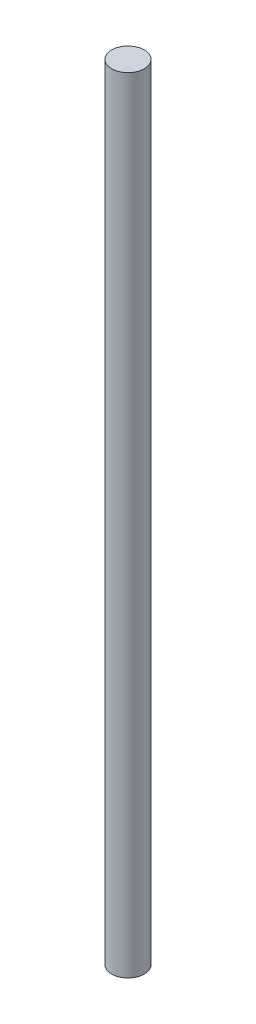
ISO-10303-21;
HEADER;
FILE_DESCRIPTION(('STEP AP214'),'2;1');
FILE_NAME('part.step','',(''),(''),'','','');
FILE_SCHEMA(('AUTOMOTIVE_DESIGN { 1 0 10303 214 1 1 1 1 }'));
ENDSEC;
DATA;
#1=APPLICATION_CONTEXT('core data for automotive mechanical design processes');
#2=APPLICATION_PROTOCOL_DEFINITION('international standard','automotive_design',2000,#1);
#3=PRODUCT_CONTEXT('',#1,'mechanical');
#4=PRODUCT('Part','Part','',(#3));
#5=PRODUCT_RELATED_PRODUCT_CATEGORY('part','',(#4));
#6=PRODUCT_DEFINITION_FORMATION('','',#4);
#7=PRODUCT_DEFINITION_CONTEXT('part definition',#1,'design');
#8=PRODUCT_DEFINITION('design','',#6,#7);
#9=PRODUCT_DEFINITION_SHAPE('','',#8);
#10=(LENGTH_UNIT() NAMED_UNIT(*) SI_UNIT(.MILLI.,.METRE.));
#11=(NAMED_UNIT(*) PLANE_ANGLE_UNIT() SI_UNIT($,.RADIAN.));
#12=(NAMED_UNIT(*) SI_UNIT($,.STERADIAN.) SOLID_ANGLE_UNIT());
#13=UNCERTAINTY_MEASURE_WITH_UNIT(LENGTH_MEASURE(1.E-05),#10,'distance_accuracy_value','');
#14=(GEOMETRIC_REPRESENTATION_CONTEXT(3) GLOBAL_UNCERTAINTY_ASSIGNED_CONTEXT((#13)) GLOBAL_UNIT_ASSIGNED_CONTEXT((#10,
#11,#12)) REPRESENTATION_CONTEXT('',''));
#15=CARTESIAN_POINT('',(0.,0.,0.));
#16=DIRECTION('',(0.,0.,1.));
#17=DIRECTION('',(1.,0.,0.));
#18=AXIS2_PLACEMENT_3D('',#15,#16,#17);
#19=CARTESIAN_POINT('',(0.,120.,0.));
#20=DIRECTION('',(0.,-1.,0.));
#21=DIRECTION('',(0.,0.,-1.));
#22=AXIS2_PLACEMENT_3D('',#19,#20,#21);
#23=CYLINDRICAL_SURFACE('',#22,2.5);
#24=CARTESIAN_POINT('',(0.,120.,0.));
#25=DIRECTION('',(0.,1.,0.));
#26=DIRECTION('',(0.,0.,1.));
#27=AXIS2_PLACEMENT_3D('',#24,#25,#26);
#28=CIRCLE('',#27,2.5);
#29=CARTESIAN_POINT('',(0.,120.,2.5));
#30=VERTEX_POINT('',#29);
#31=EDGE_CURVE('E10',#30,#30,#28,.T.);
#32=ORIENTED_EDGE('',*,*,#31,.F.);
#33=EDGE_LOOP('',(#32));
#34=FACE_BOUND('',#33,.T.);
#35=CARTESIAN_POINT('',(0.,0.,0.));
#36=DIRECTION('',(0.,1.,0.));
#37=DIRECTION('',(0.,0.,1.));
#38=AXIS2_PLACEMENT_3D('',#35,#36,#37);
#39=CIRCLE('',#38,2.5);
#40=CARTESIAN_POINT('',(0.,0.,2.5));
#41=VERTEX_POINT('',#40);
#42=EDGE_CURVE('E38',#41,#41,#39,.T.);
#43=ORIENTED_EDGE('',*,*,#42,.T.);
#44=EDGE_LOOP('',(#43));
#45=FACE_BOUND('',#44,.T.);
#46=ADVANCED_FACE('F35',(#34,#45),#23,.T.);
#47=CARTESIAN_POINT('',(0.,120.,0.));
#48=DIRECTION('',(0.,1.,0.));
#49=DIRECTION('',(0.,0.,1.));
#50=AXIS2_PLACEMENT_3D('',#47,#48,#49);
#51=PLANE('',#50);
#52=ORIENTED_EDGE('',*,*,#31,.T.);
#53=EDGE_LOOP('',(#52));
#54=FACE_BOUND('',#53,.T.);
#55=ADVANCED_FACE('F50',(#54),#51,.T.);
#56=CARTESIAN_POINT('',(0.,0.,0.));
#57=DIRECTION('',(0.,1.,0.));
#58=DIRECTION('',(0.,0.,1.));
#59=AXIS2_PLACEMENT_3D('',#56,#57,#58);
#60=PLANE('',#59);
#61=ORIENTED_EDGE('',*,*,#42,.F.);
#62=EDGE_LOOP('',(#61));
#63=FACE_BOUND('',#62,.T.);
#64=ADVANCED_FACE('F48',(#63),#60,.F.);
#65=CLOSED_SHELL('',(#46,#55,#64));
#66=MANIFOLD_SOLID_BREP('B2',#65);
#67=ADVANCED_BREP_SHAPE_REPRESENTATION('',(#18,#66),#14);
#68=SHAPE_DEFINITION_REPRESENTATION(#9,#67);
ENDSEC;
END-ISO-10303-21;
